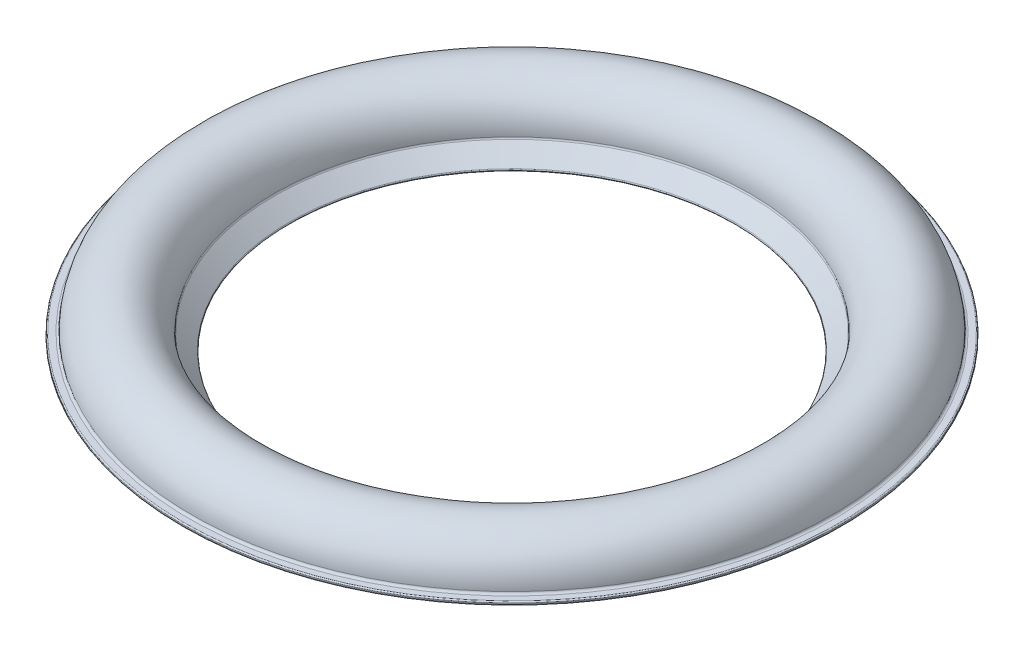
ISO-10303-21;
HEADER;
FILE_DESCRIPTION(('STEP AP214'),'2;1');
FILE_NAME('part.step','',(''),(''),'','','');
FILE_SCHEMA(('AUTOMOTIVE_DESIGN { 1 0 10303 214 1 1 1 1 }'));
ENDSEC;
DATA;
#1=APPLICATION_CONTEXT('core data for automotive mechanical design processes');
#2=APPLICATION_PROTOCOL_DEFINITION('international standard','automotive_design',2000,#1);
#3=PRODUCT_CONTEXT('',#1,'mechanical');
#4=PRODUCT('Part','Part','',(#3));
#5=PRODUCT_RELATED_PRODUCT_CATEGORY('part','',(#4));
#6=PRODUCT_DEFINITION_FORMATION('','',#4);
#7=PRODUCT_DEFINITION_CONTEXT('part definition',#1,'design');
#8=PRODUCT_DEFINITION('design','',#6,#7);
#9=PRODUCT_DEFINITION_SHAPE('','',#8);
#10=(LENGTH_UNIT() NAMED_UNIT(*) SI_UNIT(.MILLI.,.METRE.));
#11=(NAMED_UNIT(*) PLANE_ANGLE_UNIT() SI_UNIT($,.RADIAN.));
#12=(NAMED_UNIT(*) SI_UNIT($,.STERADIAN.) SOLID_ANGLE_UNIT());
#13=UNCERTAINTY_MEASURE_WITH_UNIT(LENGTH_MEASURE(1.E-05),#10,'distance_accuracy_value','');
#14=(GEOMETRIC_REPRESENTATION_CONTEXT(3) GLOBAL_UNCERTAINTY_ASSIGNED_CONTEXT((#13)) GLOBAL_UNIT_ASSIGNED_CONTEXT((#10,
#11,#12)) REPRESENTATION_CONTEXT('',''));
#15=CARTESIAN_POINT('',(0.,0.,0.));
#16=DIRECTION('',(0.,0.,1.));
#17=DIRECTION('',(1.,0.,0.));
#18=AXIS2_PLACEMENT_3D('',#15,#16,#17);
#19=CARTESIAN_POINT('',(0.,97.8774464791081,0.));
#20=DIRECTION('',(0.,-1.,0.));
#21=DIRECTION('',(0.,0.,-1.));
#22=AXIS2_PLACEMENT_3D('',#19,#20,#21);
#23=TOROIDAL_SURFACE('',#22,138.232480040969,1.);
#24=CARTESIAN_POINT('',(0.,97.823392425054,0.));
#25=DIRECTION('',(0.,-1.,0.));
#26=DIRECTION('',(0.,0.,-1.));
#27=AXIS2_PLACEMENT_3D('',#24,#25,#26);
#28=CIRCLE('',#27,137.233942030055);
#29=CARTESIAN_POINT('',(0.,97.823392425054,-137.233942030056));
#30=VERTEX_POINT('',#29);
#31=EDGE_CURVE('E92',#30,#30,#28,.T.);
#32=ORIENTED_EDGE('',*,*,#31,.T.);
#33=EDGE_LOOP('',(#32));
#34=FACE_BOUND('',#33,.T.);
#35=CARTESIAN_POINT('',(0.,96.8774464791081,0.));
#36=DIRECTION('',(0.,-1.,0.));
#37=DIRECTION('',(0.,0.,-1.));
#38=AXIS2_PLACEMENT_3D('',#35,#36,#37);
#39=CIRCLE('',#38,138.232480040969);
#40=CARTESIAN_POINT('',(0.,96.8774464791081,-138.23248004097));
#41=VERTEX_POINT('',#40);
#42=EDGE_CURVE('E11',#41,#41,#39,.T.);
#43=ORIENTED_EDGE('',*,*,#42,.F.);
#44=EDGE_LOOP('',(#43));
#45=FACE_BOUND('',#44,.T.);
#46=ADVANCED_FACE('F37',(#34,#45),#23,.F.);
#47=CARTESIAN_POINT('',(138.23248004097,96.8774464791081,0.));
#48=DIRECTION('',(0.,-1.,0.));
#49=DIRECTION('',(0.,0.,-1.));
#50=AXIS2_PLACEMENT_3D('',#47,#48,#49);
#51=PLANE('',#50);
#52=CARTESIAN_POINT('',(0.,96.8774464791081,0.));
#53=DIRECTION('',(0.,-1.,0.));
#54=DIRECTION('',(0.,0.,-1.));
#55=AXIS2_PLACEMENT_3D('',#52,#53,#54);
#56=CIRCLE('',#55,140.759526839058);
#57=CARTESIAN_POINT('',(0.,96.8774464791081,-140.759526839059));
#58=VERTEX_POINT('',#57);
#59=EDGE_CURVE('E43',#58,#58,#56,.T.);
#60=ORIENTED_EDGE('',*,*,#59,.F.);
#61=EDGE_LOOP('',(#60));
#62=FACE_BOUND('',#61,.T.);
#63=ORIENTED_EDGE('',*,*,#42,.T.);
#64=EDGE_LOOP('',(#63));
#65=FACE_BOUND('',#64,.T.);
#66=ADVANCED_FACE('F110',(#62,#65),#51,.F.);
#67=CARTESIAN_POINT('',(0.,96.3774464791081,0.));
#68=DIRECTION('',(0.,-1.,0.));
#69=DIRECTION('',(0.,0.,-1.));
#70=AXIS2_PLACEMENT_3D('',#67,#68,#69);
#71=TOROIDAL_SURFACE('',#70,140.759526839058,0.5);
#72=CARTESIAN_POINT('',(0.,96.3774464791081,0.));
#73=DIRECTION('',(0.,-1.,0.));
#74=DIRECTION('',(0.,0.,-1.));
#75=AXIS2_PLACEMENT_3D('',#72,#73,#74);
#76=CIRCLE('',#75,141.259526839058);
#77=CARTESIAN_POINT('',(0.,96.3774464791081,-141.259526839059));
#78=VERTEX_POINT('',#77);
#79=EDGE_CURVE('E47',#78,#78,#76,.T.);
#80=ORIENTED_EDGE('',*,*,#79,.F.);
#81=EDGE_LOOP('',(#80));
#82=FACE_BOUND('',#81,.T.);
#83=ORIENTED_EDGE('',*,*,#59,.T.);
#84=EDGE_LOOP('',(#83));
#85=FACE_BOUND('',#84,.T.);
#86=ADVANCED_FACE('F114',(#82,#85),#71,.T.);
#87=CARTESIAN_POINT('',(0.,0.,0.));
#88=DIRECTION('',(0.,-1.,0.));
#89=DIRECTION('',(0.,0.,-1.));
#90=AXIS2_PLACEMENT_3D('',#87,#88,#89);
#91=CYLINDRICAL_SURFACE('',#90,141.259526839058);
#92=CARTESIAN_POINT('',(0.,95.8774464791081,0.));
#93=DIRECTION('',(0.,-1.,0.));
#94=DIRECTION('',(0.,0.,-1.));
#95=AXIS2_PLACEMENT_3D('',#92,#93,#94);
#96=CIRCLE('',#95,141.259526839058);
#97=CARTESIAN_POINT('',(0.,95.8774464791081,-141.259526839059));
#98=VERTEX_POINT('',#97);
#99=EDGE_CURVE('E51',#98,#98,#96,.T.);
#100=ORIENTED_EDGE('',*,*,#99,.F.);
#101=EDGE_LOOP('',(#100));
#102=FACE_BOUND('',#101,.T.);
#103=ORIENTED_EDGE('',*,*,#79,.T.);
#104=EDGE_LOOP('',(#103));
#105=FACE_BOUND('',#104,.T.);
#106=ADVANCED_FACE('F119',(#102,#105),#91,.T.);
#107=CARTESIAN_POINT('',(0.,95.8774464791081,0.));
#108=DIRECTION('',(0.,-1.,0.));
#109=DIRECTION('',(0.,0.,-1.));
#110=AXIS2_PLACEMENT_3D('',#107,#108,#109);
#111=TOROIDAL_SURFACE('',#110,140.759526839058,0.5);
#112=CARTESIAN_POINT('',(0.,95.3774464791081,0.));
#113=DIRECTION('',(0.,-1.,0.));
#114=DIRECTION('',(0.,0.,-1.));
#115=AXIS2_PLACEMENT_3D('',#112,#113,#114);
#116=CIRCLE('',#115,140.759526839058);
#117=CARTESIAN_POINT('',(0.,95.3774464791081,-140.759526839059));
#118=VERTEX_POINT('',#117);
#119=EDGE_CURVE('E56',#118,#118,#116,.T.);
#120=ORIENTED_EDGE('',*,*,#119,.F.);
#121=EDGE_LOOP('',(#120));
#122=FACE_BOUND('',#121,.T.);
#123=ORIENTED_EDGE('',*,*,#99,.T.);
#124=EDGE_LOOP('',(#123));
#125=FACE_BOUND('',#124,.T.);
#126=ADVANCED_FACE('F125',(#122,#125),#111,.T.);
#127=CARTESIAN_POINT('',(140.759526839059,95.3774464791081,0.));
#128=DIRECTION('',(0.,1.,0.));
#129=DIRECTION('',(0.,0.,1.));
#130=AXIS2_PLACEMENT_3D('',#127,#128,#129);
#131=PLANE('',#130);
#132=CARTESIAN_POINT('',(0.,95.3774464791081,0.));
#133=DIRECTION('',(0.,-1.,0.));
#134=DIRECTION('',(0.,0.,-1.));
#135=AXIS2_PLACEMENT_3D('',#132,#133,#134);
#136=CIRCLE('',#135,136.752172307024);
#137=CARTESIAN_POINT('',(0.,95.3774464791081,-136.752172307024));
#138=VERTEX_POINT('',#137);
#139=EDGE_CURVE('E59',#138,#138,#136,.T.);
#140=ORIENTED_EDGE('',*,*,#139,.F.);
#141=EDGE_LOOP('',(#140));
#142=FACE_BOUND('',#141,.T.);
#143=ORIENTED_EDGE('',*,*,#119,.T.);
#144=EDGE_LOOP('',(#143));
#145=FACE_BOUND('',#144,.T.);
#146=ADVANCED_FACE('F129',(#142,#145),#131,.F.);
#147=CARTESIAN_POINT('',(0.,96.3774464791081,0.));
#148=DIRECTION('',(0.,-1.,0.));
#149=DIRECTION('',(0.,0.,-1.));
#150=AXIS2_PLACEMENT_3D('',#147,#148,#149);
#151=TOROIDAL_SURFACE('',#150,136.752172307024,1.00000000000002);
#152=CARTESIAN_POINT('',(0.,96.4068582438139,0.));
#153=DIRECTION('',(0.,-1.,0.));
#154=DIRECTION('',(0.,0.,-1.));
#155=AXIS2_PLACEMENT_3D('',#152,#153,#154);
#156=CIRCLE('',#155,135.752604926555);
#157=CARTESIAN_POINT('',(0.,96.4068582438139,-135.752604926556));
#158=VERTEX_POINT('',#157);
#159=EDGE_CURVE('E62',#158,#158,#156,.T.);
#160=ORIENTED_EDGE('',*,*,#159,.F.);
#161=EDGE_LOOP('',(#160));
#162=FACE_BOUND('',#161,.T.);
#163=ORIENTED_EDGE('',*,*,#139,.T.);
#164=EDGE_LOOP('',(#163));
#165=FACE_BOUND('',#164,.T.);
#166=ADVANCED_FACE('F133',(#162,#165),#151,.T.);
#167=CARTESIAN_POINT('',(0.,96.8774464791078,0.));
#168=DIRECTION('',(0.,-1.,0.));
#169=DIRECTION('',(0.,0.,-1.));
#170=AXIS2_PLACEMENT_3D('',#167,#168,#169);
#171=TOROIDAL_SURFACE('',#170,119.759526839058,15.9999999999989);
#172=CARTESIAN_POINT('',(0.,96.7057488276495,0.));
#173=DIRECTION('',(0.,-1.,0.));
#174=DIRECTION('',(0.,0.,-1.));
#175=AXIS2_PLACEMENT_3D('',#172,#173,#174);
#176=CIRCLE('',#175,103.760448118193);
#177=CARTESIAN_POINT('',(0.,96.7057488276495,-103.760448118193));
#178=VERTEX_POINT('',#177);
#179=EDGE_CURVE('E65',#178,#178,#176,.T.);
#180=ORIENTED_EDGE('',*,*,#179,.F.);
#181=EDGE_LOOP('',(#180));
#182=FACE_BOUND('',#181,.T.);
#183=ORIENTED_EDGE('',*,*,#159,.T.);
#184=EDGE_LOOP('',(#183));
#185=FACE_BOUND('',#184,.T.);
#186=ADVANCED_FACE('F137',(#182,#185),#171,.F.);
#187=CARTESIAN_POINT('',(0.,96.6950177244334,0.));
#188=DIRECTION('',(0.,-1.,0.));
#189=DIRECTION('',(0.,0.,-1.));
#190=AXIS2_PLACEMENT_3D('',#187,#188,#189);
#191=TOROIDAL_SURFACE('',#190,102.760505698139,1.00000000000001);
#192=CARTESIAN_POINT('',(0.,95.9879109432468,0.));
#193=DIRECTION('',(0.,-1.,0.));
#194=DIRECTION('',(0.,0.,-1.));
#195=AXIS2_PLACEMENT_3D('',#192,#193,#194);
#196=CIRCLE('',#195,103.467612479325);
#197=CARTESIAN_POINT('',(0.,95.9879109432468,-103.467612479326));
#198=VERTEX_POINT('',#197);
#199=EDGE_CURVE('E68',#198,#198,#196,.T.);
#200=ORIENTED_EDGE('',*,*,#199,.F.);
#201=EDGE_LOOP('',(#200));
#202=FACE_BOUND('',#201,.T.);
#203=ORIENTED_EDGE('',*,*,#179,.T.);
#204=EDGE_LOOP('',(#203));
#205=FACE_BOUND('',#204,.T.);
#206=ADVANCED_FACE('F141',(#202,#205),#191,.T.);
#207=CARTESIAN_POINT('',(0.,95.3758706645026,0.));
#208=DIRECTION('',(0.,1.,0.));
#209=DIRECTION('',(0.,0.,1.));
#210=AXIS2_PLACEMENT_3D('',#207,#208,#209);
#211=CONICAL_SURFACE('',#210,102.855572200581,0.785398163397482);
#212=ORIENTED_EDGE('',*,*,#199,.T.);
#213=EDGE_LOOP('',(#212));
#214=FACE_BOUND('',#213,.T.);
#215=CARTESIAN_POINT('',(0.,95.3758706645026,0.));
#216=DIRECTION('',(0.,-1.,0.));
#217=DIRECTION('',(0.,0.,-1.));
#218=AXIS2_PLACEMENT_3D('',#215,#216,#217);
#219=CIRCLE('',#218,102.855572200581);
#220=CARTESIAN_POINT('',(0.,95.3758706645026,-102.855572200581));
#221=VERTEX_POINT('',#220);
#222=EDGE_CURVE('E71',#221,#221,#219,.T.);
#223=ORIENTED_EDGE('',*,*,#222,.F.);
#224=EDGE_LOOP('',(#223));
#225=FACE_BOUND('',#224,.T.);
#226=ADVANCED_FACE('F145',(#214,#225),#211,.T.);
#227=CARTESIAN_POINT('',(0.,89.2549432980966,0.));
#228=DIRECTION('',(0.,1.,0.));
#229=DIRECTION('',(0.,0.,1.));
#230=AXIS2_PLACEMENT_3D('',#227,#228,#229);
#231=CONICAL_SURFACE('',#230,96.3945933138191,0.812418612584716);
#232=ORIENTED_EDGE('',*,*,#222,.T.);
#233=EDGE_LOOP('',(#232));
#234=FACE_BOUND('',#233,.T.);
#235=CARTESIAN_POINT('',(0.,89.2549432980966,0.));
#236=DIRECTION('',(0.,-1.,0.));
#237=DIRECTION('',(0.,0.,-1.));
#238=AXIS2_PLACEMENT_3D('',#235,#236,#237);
#239=CIRCLE('',#238,96.3945933138191);
#240=CARTESIAN_POINT('',(0.,89.2549432980966,-96.3945933138195));
#241=VERTEX_POINT('',#240);
#242=EDGE_CURVE('E74',#241,#241,#239,.T.);
#243=ORIENTED_EDGE('',*,*,#242,.F.);
#244=EDGE_LOOP('',(#243));
#245=FACE_BOUND('',#244,.T.);
#246=ADVANCED_FACE('F149',(#234,#245),#231,.T.);
#247=CARTESIAN_POINT('',(0.,89.6179196400496,0.));
#248=DIRECTION('',(0.,-1.,0.));
#249=DIRECTION('',(0.,0.,-1.));
#250=AXIS2_PLACEMENT_3D('',#247,#248,#249);
#251=TOROIDAL_SURFACE('',#250,96.0507209898637,0.500000000000009);
#252=ORIENTED_EDGE('',*,*,#242,.T.);
#253=EDGE_LOOP('',(#252));
#254=FACE_BOUND('',#253,.T.);
#255=CARTESIAN_POINT('',(0.,89.2740473160941,0.));
#256=DIRECTION('',(0.,-1.,0.));
#257=DIRECTION('',(0.,0.,-1.));
#258=AXIS2_PLACEMENT_3D('',#255,#256,#257);
#259=CIRCLE('',#258,95.6877446479108);
#260=CARTESIAN_POINT('',(0.,89.2740473160941,-95.6877446479112));
#261=VERTEX_POINT('',#260);
#262=EDGE_CURVE('E77',#261,#261,#259,.T.);
#263=ORIENTED_EDGE('',*,*,#262,.F.);
#264=EDGE_LOOP('',(#263));
#265=FACE_BOUND('',#264,.T.);
#266=ADVANCED_FACE('F153',(#254,#265),#251,.T.);
#267=CARTESIAN_POINT('',(0.,89.6370236580471,0.));
#268=DIRECTION('',(0.,-1.,0.));
#269=DIRECTION('',(0.,0.,-1.));
#270=AXIS2_PLACEMENT_3D('',#267,#268,#269);
#271=CONICAL_SURFACE('',#270,95.3438723239554,0.758377714210198);
#272=ORIENTED_EDGE('',*,*,#262,.T.);
#273=EDGE_LOOP('',(#272));
#274=FACE_BOUND('',#273,.T.);
#275=CARTESIAN_POINT('',(0.,89.6370236580471,0.));
#276=DIRECTION('',(0.,-1.,0.));
#277=DIRECTION('',(0.,0.,-1.));
#278=AXIS2_PLACEMENT_3D('',#275,#276,#277);
#279=CIRCLE('',#278,95.3438723239554);
#280=CARTESIAN_POINT('',(0.,89.6370236580471,-95.3438723239557));
#281=VERTEX_POINT('',#280);
#282=EDGE_CURVE('E80',#281,#281,#279,.T.);
#283=ORIENTED_EDGE('',*,*,#282,.F.);
#284=EDGE_LOOP('',(#283));
#285=FACE_BOUND('',#284,.T.);
#286=ADVANCED_FACE('F157',(#274,#285),#271,.F.);
#287=CARTESIAN_POINT('',(0.,89.9808959820025,0.));
#288=DIRECTION('',(0.,-1.,0.));
#289=DIRECTION('',(0.,0.,-1.));
#290=AXIS2_PLACEMENT_3D('',#287,#288,#289);
#291=TOROIDAL_SURFACE('',#290,95.7068486659083,0.500000000000014);
#292=ORIENTED_EDGE('',*,*,#282,.T.);
#293=EDGE_LOOP('',(#292));
#294=FACE_BOUND('',#293,.T.);
#295=CARTESIAN_POINT('',(0.,90.3438723239554,0.));
#296=DIRECTION('',(0.,-1.,0.));
#297=DIRECTION('',(0.,0.,-1.));
#298=AXIS2_PLACEMENT_3D('',#295,#296,#297);
#299=CIRCLE('',#298,95.3629763419529);
#300=CARTESIAN_POINT('',(0.,90.3438723239554,-95.3629763419532));
#301=VERTEX_POINT('',#300);
#302=EDGE_CURVE('E83',#301,#301,#299,.T.);
#303=ORIENTED_EDGE('',*,*,#302,.F.);
#304=EDGE_LOOP('',(#303));
#305=FACE_BOUND('',#304,.T.);
#306=ADVANCED_FACE('F161',(#294,#305),#291,.T.);
#307=CARTESIAN_POINT('',(0.,90.3438723239554,0.));
#308=DIRECTION('',(0.,1.,0.));
#309=DIRECTION('',(0.,0.,1.));
#310=AXIS2_PLACEMENT_3D('',#307,#308,#309);
#311=CONICAL_SURFACE('',#310,95.3629763419529,0.812418612584717);
#312=CARTESIAN_POINT('',(0.,96.5864707980292,0.));
#313=DIRECTION('',(0.,-1.,0.));
#314=DIRECTION('',(0.,0.,-1.));
#315=AXIS2_PLACEMENT_3D('',#312,#313,#314);
#316=CIRCLE('',#315,101.952385842364);
#317=CARTESIAN_POINT('',(0.,96.5864707980292,-101.952385842365));
#318=VERTEX_POINT('',#317);
#319=EDGE_CURVE('E86',#318,#318,#316,.T.);
#320=ORIENTED_EDGE('',*,*,#319,.F.);
#321=EDGE_LOOP('',(#320));
#322=FACE_BOUND('',#321,.T.);
#323=ORIENTED_EDGE('',*,*,#302,.T.);
#324=EDGE_LOOP('',(#323));
#325=FACE_BOUND('',#324,.T.);
#326=ADVANCED_FACE('F106',(#322,#325),#311,.F.);
#327=CARTESIAN_POINT('',(0.,97.312423481935,0.));
#328=DIRECTION('',(0.,-1.,0.));
#329=DIRECTION('',(0.,0.,-1.));
#330=AXIS2_PLACEMENT_3D('',#327,#328,#329);
#331=TOROIDAL_SURFACE('',#330,101.264641194453,1.);
#332=ORIENTED_EDGE('',*,*,#319,.T.);
#333=EDGE_LOOP('',(#332));
#334=FACE_BOUND('',#333,.T.);
#335=CARTESIAN_POINT('',(0.,97.2889112115119,0.));
#336=DIRECTION('',(0.,-1.,0.));
#337=DIRECTION('',(0.,0.,-1.));
#338=AXIS2_PLACEMENT_3D('',#335,#336,#337);
#339=CIRCLE('',#338,102.26436474281);
#340=CARTESIAN_POINT('',(0.,97.2889112115119,-102.264364742811));
#341=VERTEX_POINT('',#340);
#342=EDGE_CURVE('E89',#341,#341,#339,.T.);
#343=ORIENTED_EDGE('',*,*,#342,.F.);
#344=EDGE_LOOP('',(#343));
#345=FACE_BOUND('',#344,.T.);
#346=ADVANCED_FACE('F100',(#334,#345),#331,.F.);
#347=CARTESIAN_POINT('',(0.,96.8774464791078,0.));
#348=DIRECTION('',(0.,-1.,0.));
#349=DIRECTION('',(0.,0.,-1.));
#350=AXIS2_PLACEMENT_3D('',#347,#348,#349);
#351=TOROIDAL_SURFACE('',#350,119.759526839058,17.5);
#352=ORIENTED_EDGE('',*,*,#342,.T.);
#353=EDGE_LOOP('',(#352));
#354=FACE_BOUND('',#353,.T.);
#355=ORIENTED_EDGE('',*,*,#31,.F.);
#356=EDGE_LOOP('',(#355));
#357=FACE_BOUND('',#356,.T.);
#358=ADVANCED_FACE('F98',(#354,#357),#351,.T.);
#359=CLOSED_SHELL('',(#46,#66,#86,#106,#126,#146,#166,#186,#206,#226,#246,#266,#286,#306,#326,
#346,#358));
#360=MANIFOLD_SOLID_BREP('B2',#359);
#361=ADVANCED_BREP_SHAPE_REPRESENTATION('',(#18,#360),#14);
#362=SHAPE_DEFINITION_REPRESENTATION(#9,#361);
ENDSEC;
END-ISO-10303-21;
